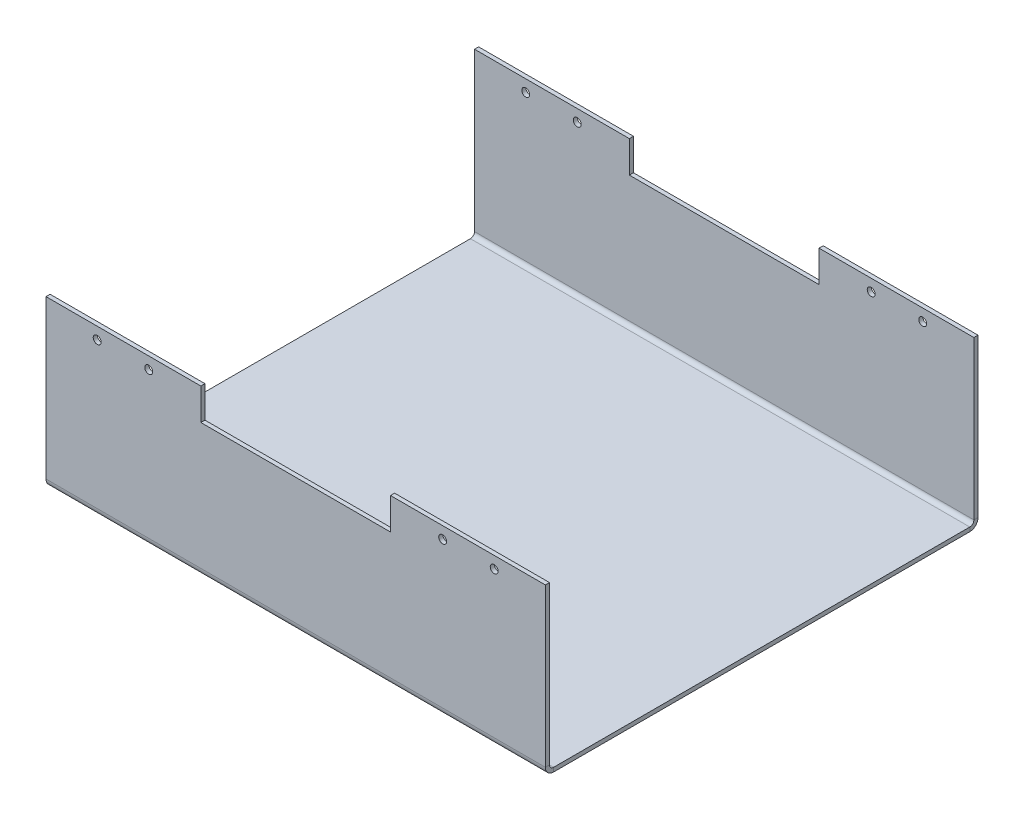
ISO-10303-21;
HEADER;
FILE_DESCRIPTION(('STEP AP214'),'2;1');
FILE_NAME('part.step','',(''),(''),'','','');
FILE_SCHEMA(('AUTOMOTIVE_DESIGN { 1 0 10303 214 1 1 1 1 }'));
ENDSEC;
DATA;
#1=APPLICATION_CONTEXT('core data for automotive mechanical design processes');
#2=APPLICATION_PROTOCOL_DEFINITION('international standard','automotive_design',2000,#1);
#3=PRODUCT_CONTEXT('',#1,'mechanical');
#4=PRODUCT('Part','Part','',(#3));
#5=PRODUCT_RELATED_PRODUCT_CATEGORY('part','',(#4));
#6=PRODUCT_DEFINITION_FORMATION('','',#4);
#7=PRODUCT_DEFINITION_CONTEXT('part definition',#1,'design');
#8=PRODUCT_DEFINITION('design','',#6,#7);
#9=PRODUCT_DEFINITION_SHAPE('','',#8);
#10=(LENGTH_UNIT() NAMED_UNIT(*) SI_UNIT(.MILLI.,.METRE.));
#11=(NAMED_UNIT(*) PLANE_ANGLE_UNIT() SI_UNIT($,.RADIAN.));
#12=(NAMED_UNIT(*) SI_UNIT($,.STERADIAN.) SOLID_ANGLE_UNIT());
#13=UNCERTAINTY_MEASURE_WITH_UNIT(LENGTH_MEASURE(1.E-05),#10,'distance_accuracy_value','');
#14=(GEOMETRIC_REPRESENTATION_CONTEXT(3) GLOBAL_UNCERTAINTY_ASSIGNED_CONTEXT((#13)) GLOBAL_UNIT_ASSIGNED_CONTEXT((#10,
#11,#12)) REPRESENTATION_CONTEXT('',''));
#15=CARTESIAN_POINT('',(0.,0.,0.));
#16=DIRECTION('',(0.,0.,1.));
#17=DIRECTION('',(1.,0.,0.));
#18=AXIS2_PLACEMENT_3D('',#15,#16,#17);
#19=CARTESIAN_POINT('',(200.64222,3.302,301.924236700255));
#20=DIRECTION('',(0.,1.,0.));
#21=DIRECTION('',(0.,0.,1.));
#22=AXIS2_PLACEMENT_3D('',#19,#20,#21);
#23=PLANE('',#22);
#24=DIRECTION('',(0.,0.,-1.));
#25=VECTOR('',#24,1.);
#26=CARTESIAN_POINT('',(200.64222,3.302,301.924236700255));
#27=LINE('',#26,#25);
#28=CARTESIAN_POINT('',(200.64222,3.30200000000001,167.224159596948));
#29=VERTEX_POINT('',#28);
#30=CARTESIAN_POINT('',(200.64222,3.302,-167.224159596948));
#31=VERTEX_POINT('',#30);
#32=EDGE_CURVE('E48',#29,#31,#27,.T.);
#33=ORIENTED_EDGE('',*,*,#32,.T.);
#34=DIRECTION('',(-1.,0.,0.));
#35=VECTOR('',#34,1.);
#36=CARTESIAN_POINT('',(200.64222,3.302,-167.224159596948));
#37=LINE('',#36,#35);
#38=CARTESIAN_POINT('',(-200.64222,3.302,-167.224159596948));
#39=VERTEX_POINT('',#38);
#40=EDGE_CURVE('E331',#31,#39,#37,.T.);
#41=ORIENTED_EDGE('',*,*,#40,.T.);
#42=DIRECTION('',(0.,0.,1.));
#43=VECTOR('',#42,1.);
#44=CARTESIAN_POINT('',(-200.64222,3.302,301.924236700255));
#45=LINE('',#44,#43);
#46=CARTESIAN_POINT('',(-200.64222,3.302,167.224159596948));
#47=VERTEX_POINT('',#46);
#48=EDGE_CURVE('E324',#39,#47,#45,.T.);
#49=ORIENTED_EDGE('',*,*,#48,.T.);
#50=DIRECTION('',(-1.,0.,0.));
#51=VECTOR('',#50,1.);
#52=CARTESIAN_POINT('',(200.64222,3.302,167.224159596948));
#53=LINE('',#52,#51);
#54=EDGE_CURVE('E321',#29,#47,#53,.T.);
#55=ORIENTED_EDGE('',*,*,#54,.F.);
#56=EDGE_LOOP('',(#33,#41,#49,#55));
#57=FACE_BOUND('',#56,.T.);
#58=ADVANCED_FACE('F44',(#57),#23,.T.);
#59=CARTESIAN_POINT('',(200.64222,0.,301.924236700255));
#60=DIRECTION('',(0.,1.,0.));
#61=DIRECTION('',(0.,0.,1.));
#62=AXIS2_PLACEMENT_3D('',#59,#60,#61);
#63=PLANE('',#62);
#64=DIRECTION('',(-1.,0.,0.));
#65=VECTOR('',#64,1.);
#66=CARTESIAN_POINT('',(200.64222,0.,-167.224159596948));
#67=LINE('',#66,#65);
#68=CARTESIAN_POINT('',(200.64222,0.,-167.224159596948));
#69=VERTEX_POINT('',#68);
#70=CARTESIAN_POINT('',(-200.64222,0.,-167.224159596948));
#71=VERTEX_POINT('',#70);
#72=EDGE_CURVE('E53',#69,#71,#67,.T.);
#73=ORIENTED_EDGE('',*,*,#72,.F.);
#74=DIRECTION('',(0.,0.,-1.));
#75=VECTOR('',#74,1.);
#76=CARTESIAN_POINT('',(200.64222,0.,301.924236700255));
#77=LINE('',#76,#75);
#78=CARTESIAN_POINT('',(200.64222,0.,167.224159596948));
#79=VERTEX_POINT('',#78);
#80=EDGE_CURVE('E69',#79,#69,#77,.T.);
#81=ORIENTED_EDGE('',*,*,#80,.F.);
#82=DIRECTION('',(-1.,0.,0.));
#83=VECTOR('',#82,1.);
#84=CARTESIAN_POINT('',(200.64222,0.,167.224159596948));
#85=LINE('',#84,#83);
#86=CARTESIAN_POINT('',(-200.64222,0.,167.224159596948));
#87=VERTEX_POINT('',#86);
#88=EDGE_CURVE('E327',#79,#87,#85,.T.);
#89=ORIENTED_EDGE('',*,*,#88,.T.);
#90=DIRECTION('',(0.,0.,1.));
#91=VECTOR('',#90,1.);
#92=CARTESIAN_POINT('',(-200.64222,0.,301.924236700255));
#93=LINE('',#92,#91);
#94=EDGE_CURVE('E61',#71,#87,#93,.T.);
#95=ORIENTED_EDGE('',*,*,#94,.F.);
#96=EDGE_LOOP('',(#73,#81,#89,#95));
#97=FACE_BOUND('',#96,.T.);
#98=ADVANCED_FACE('F378',(#97),#63,.F.);
#99=CARTESIAN_POINT('',(-200.64222,3.302,301.924236700255));
#100=DIRECTION('',(1.,0.,0.));
#101=DIRECTION('',(0.,0.,-1.));
#102=AXIS2_PLACEMENT_3D('',#99,#100,#101);
#103=PLANE('',#102);
#104=DIRECTION('',(0.,1.,0.));
#105=VECTOR('',#104,1.);
#106=CARTESIAN_POINT('',(-200.64222,3.30199999999997,-167.224159596948));
#107=LINE('',#106,#105);
#108=EDGE_CURVE('E12',#71,#39,#107,.T.);
#109=ORIENTED_EDGE('',*,*,#108,.F.);
#110=ORIENTED_EDGE('',*,*,#94,.T.);
#111=DIRECTION('',(0.,1.,0.));
#112=VECTOR('',#111,1.);
#113=CARTESIAN_POINT('',(-200.64222,3.30199999999999,167.224159596948));
#114=LINE('',#113,#112);
#115=EDGE_CURVE('E323',#87,#47,#114,.T.);
#116=ORIENTED_EDGE('',*,*,#115,.T.);
#117=ORIENTED_EDGE('',*,*,#48,.F.);
#118=EDGE_LOOP('',(#109,#110,#116,#117));
#119=FACE_BOUND('',#118,.T.);
#120=ADVANCED_FACE('F46',(#119),#103,.F.);
#121=CARTESIAN_POINT('',(200.64222,3.302,301.924236700255));
#122=DIRECTION('',(-1.,0.,0.));
#123=DIRECTION('',(0.,0.,1.));
#124=AXIS2_PLACEMENT_3D('',#121,#122,#123);
#125=PLANE('',#124);
#126=DIRECTION('',(0.,-1.,0.));
#127=VECTOR('',#126,1.);
#128=CARTESIAN_POINT('',(200.64222,3.30199999999997,-167.224159596948));
#129=LINE('',#128,#127);
#130=EDGE_CURVE('E334',#31,#69,#129,.T.);
#131=ORIENTED_EDGE('',*,*,#130,.F.);
#132=ORIENTED_EDGE('',*,*,#32,.F.);
#133=DIRECTION('',(0.,-1.,0.));
#134=VECTOR('',#133,1.);
#135=CARTESIAN_POINT('',(200.64222,3.30199999999999,167.224159596948));
#136=LINE('',#135,#134);
#137=EDGE_CURVE('E329',#29,#79,#136,.T.);
#138=ORIENTED_EDGE('',*,*,#137,.T.);
#139=ORIENTED_EDGE('',*,*,#80,.T.);
#140=EDGE_LOOP('',(#131,#132,#138,#139));
#141=FACE_BOUND('',#140,.T.);
#142=ADVANCED_FACE('F345',(#141),#125,.F.);
#143=CARTESIAN_POINT('',(200.64222,6.604,167.224159596948));
#144=DIRECTION('',(-1.,0.,0.));
#145=DIRECTION('',(0.,0.,1.));
#146=AXIS2_PLACEMENT_3D('',#143,#144,#145);
#147=PLANE('',#146);
#148=DIRECTION('',(0.,0.,1.));
#149=VECTOR('',#148,1.);
#150=CARTESIAN_POINT('',(200.64222,6.60400000000003,170.526159596948));
#151=LINE('',#150,#149);
#152=CARTESIAN_POINT('',(200.64222,6.604,170.526159596948));
#153=VERTEX_POINT('',#152);
#154=CARTESIAN_POINT('',(200.64222,6.60400000000005,173.828159596948));
#155=VERTEX_POINT('',#154);
#156=EDGE_CURVE('E244',#153,#155,#151,.T.);
#157=ORIENTED_EDGE('',*,*,#156,.T.);
#158=CARTESIAN_POINT('',(200.64222,6.604,167.224159596948));
#159=DIRECTION('',(1.,0.,0.));
#160=DIRECTION('',(0.,0.,-1.));
#161=AXIS2_PLACEMENT_3D('',#158,#159,#160);
#162=CIRCLE('',#161,6.604);
#163=EDGE_CURVE('E253',#155,#79,#162,.T.);
#164=ORIENTED_EDGE('',*,*,#163,.T.);
#165=ORIENTED_EDGE('',*,*,#137,.F.);
#166=CARTESIAN_POINT('',(200.64222,6.604,167.224159596948));
#167=DIRECTION('',(1.,0.,0.));
#168=DIRECTION('',(0.,0.,-1.));
#169=AXIS2_PLACEMENT_3D('',#166,#167,#168);
#170=CIRCLE('',#169,3.30199999999999);
#171=EDGE_CURVE('E311',#153,#29,#170,.T.);
#172=ORIENTED_EDGE('',*,*,#171,.F.);
#173=EDGE_LOOP('',(#157,#164,#165,#172));
#174=FACE_BOUND('',#173,.T.);
#175=ADVANCED_FACE('F382',(#174),#147,.F.);
#176=CARTESIAN_POINT('',(-200.64222,6.604,167.224159596948));
#177=DIRECTION('',(1.,0.,0.));
#178=DIRECTION('',(0.,0.,-1.));
#179=AXIS2_PLACEMENT_3D('',#176,#177,#178);
#180=PLANE('',#179);
#181=CARTESIAN_POINT('',(-200.64222,6.604,167.224159596948));
#182=DIRECTION('',(1.,0.,0.));
#183=DIRECTION('',(0.,0.,-1.));
#184=AXIS2_PLACEMENT_3D('',#181,#182,#183);
#185=CIRCLE('',#184,6.604);
#186=CARTESIAN_POINT('',(-200.64222,6.60400000000003,173.828159596948));
#187=VERTEX_POINT('',#186);
#188=EDGE_CURVE('E315',#87,#187,#185,.F.);
#189=ORIENTED_EDGE('',*,*,#188,.T.);
#190=DIRECTION('',(0.,0.,-1.));
#191=VECTOR('',#190,1.);
#192=CARTESIAN_POINT('',(-200.64222,6.60400000000003,170.526159596948));
#193=LINE('',#192,#191);
#194=CARTESIAN_POINT('',(-200.64222,6.60400000000003,170.526159596948));
#195=VERTEX_POINT('',#194);
#196=EDGE_CURVE('E303',#187,#195,#193,.T.);
#197=ORIENTED_EDGE('',*,*,#196,.T.);
#198=CARTESIAN_POINT('',(-200.64222,6.604,167.224159596948));
#199=DIRECTION('',(-1.,0.,0.));
#200=DIRECTION('',(0.,0.,1.));
#201=AXIS2_PLACEMENT_3D('',#198,#199,#200);
#202=CIRCLE('',#201,3.302);
#203=EDGE_CURVE('E314',#47,#195,#202,.T.);
#204=ORIENTED_EDGE('',*,*,#203,.F.);
#205=ORIENTED_EDGE('',*,*,#115,.F.);
#206=EDGE_LOOP('',(#189,#197,#204,#205));
#207=FACE_BOUND('',#206,.T.);
#208=ADVANCED_FACE('F397',(#207),#180,.F.);
#209=CARTESIAN_POINT('',(-401.373436826096,6.604,167.224159596948));
#210=DIRECTION('',(1.,0.,0.));
#211=DIRECTION('',(0.,0.,-1.));
#212=AXIS2_PLACEMENT_3D('',#209,#210,#211);
#213=CYLINDRICAL_SURFACE('',#212,3.302);
#214=ORIENTED_EDGE('',*,*,#54,.T.);
#215=ORIENTED_EDGE('',*,*,#203,.T.);
#216=DIRECTION('',(-1.,0.,0.));
#217=VECTOR('',#216,1.);
#218=CARTESIAN_POINT('',(200.64222,6.60400000000003,170.526159596948));
#219=LINE('',#218,#217);
#220=EDGE_CURVE('E272',#153,#195,#219,.T.);
#221=ORIENTED_EDGE('',*,*,#220,.F.);
#222=ORIENTED_EDGE('',*,*,#171,.T.);
#223=EDGE_LOOP('',(#214,#215,#221,#222));
#224=FACE_BOUND('',#223,.T.);
#225=ADVANCED_FACE('F386',(#224),#213,.F.);
#226=CARTESIAN_POINT('',(-401.373436826096,6.604,167.224159596948));
#227=DIRECTION('',(1.,0.,0.));
#228=DIRECTION('',(0.,0.,-1.));
#229=AXIS2_PLACEMENT_3D('',#226,#227,#228);
#230=CYLINDRICAL_SURFACE('',#229,6.604);
#231=ORIENTED_EDGE('',*,*,#88,.F.);
#232=ORIENTED_EDGE('',*,*,#163,.F.);
#233=DIRECTION('',(-1.,0.,0.));
#234=VECTOR('',#233,1.);
#235=CARTESIAN_POINT('',(200.64222,6.60400000000003,173.828159596948));
#236=LINE('',#235,#234);
#237=EDGE_CURVE('E306',#155,#187,#236,.T.);
#238=ORIENTED_EDGE('',*,*,#237,.T.);
#239=ORIENTED_EDGE('',*,*,#188,.F.);
#240=EDGE_LOOP('',(#231,#232,#238,#239));
#241=FACE_BOUND('',#240,.T.);
#242=ADVANCED_FACE('F400',(#241),#230,.T.);
#243=CARTESIAN_POINT('',(76.2000000000012,133.523922896692,170.526159596947));
#244=DIRECTION('',(0.,-1.,0.));
#245=DIRECTION('',(-1.,0.,0.));
#246=AXIS2_PLACEMENT_3D('',#243,#244,#245);
#247=PLANE('',#246);
#248=DIRECTION('',(1.,0.,0.));
#249=VECTOR('',#248,1.);
#250=CARTESIAN_POINT('',(76.2000000000012,133.523922896692,173.828159596947));
#251=LINE('',#250,#249);
#252=CARTESIAN_POINT('',(76.2000000000012,133.523922896692,173.828159596947));
#253=VERTEX_POINT('',#252);
#254=CARTESIAN_POINT('',(200.64222,133.523922896692,173.828159596947));
#255=VERTEX_POINT('',#254);
#256=EDGE_CURVE('E300',#253,#255,#251,.T.);
#257=ORIENTED_EDGE('',*,*,#256,.T.);
#258=DIRECTION('',(0.,0.,1.));
#259=VECTOR('',#258,1.);
#260=CARTESIAN_POINT('',(200.64222,133.523922896692,170.526159596947));
#261=LINE('',#260,#259);
#262=CARTESIAN_POINT('',(200.64222,133.523922896692,170.526159596947));
#263=VERTEX_POINT('',#262);
#264=EDGE_CURVE('E254',#263,#255,#261,.T.);
#265=ORIENTED_EDGE('',*,*,#264,.F.);
#266=DIRECTION('',(1.,0.,0.));
#267=VECTOR('',#266,1.);
#268=CARTESIAN_POINT('',(76.2000000000012,133.523922896692,170.526159596947));
#269=LINE('',#268,#267);
#270=CARTESIAN_POINT('',(76.2000000000012,133.523922896692,170.526159596947));
#271=VERTEX_POINT('',#270);
#272=EDGE_CURVE('E259',#271,#263,#269,.T.);
#273=ORIENTED_EDGE('',*,*,#272,.F.);
#274=DIRECTION('',(0.,0.,1.));
#275=VECTOR('',#274,1.);
#276=CARTESIAN_POINT('',(76.2000000000012,133.523922896692,170.526159596947));
#277=LINE('',#276,#275);
#278=EDGE_CURVE('E297',#271,#253,#277,.T.);
#279=ORIENTED_EDGE('',*,*,#278,.T.);
#280=EDGE_LOOP('',(#257,#265,#273,#279));
#281=FACE_BOUND('',#280,.T.);
#282=ADVANCED_FACE('F411',(#281),#247,.F.);
#283=CARTESIAN_POINT('',(76.2000000000013,108.123922896692,170.526159596947));
#284=DIRECTION('',(1.,0.,0.));
#285=DIRECTION('',(0.,-1.,0.));
#286=AXIS2_PLACEMENT_3D('',#283,#284,#285);
#287=PLANE('',#286);
#288=DIRECTION('',(0.,1.,0.));
#289=VECTOR('',#288,1.);
#290=CARTESIAN_POINT('',(76.2000000000013,108.123922896692,173.828159596947));
#291=LINE('',#290,#289);
#292=CARTESIAN_POINT('',(76.2000000000013,108.123922896692,173.828159596947));
#293=VERTEX_POINT('',#292);
#294=EDGE_CURVE('E295',#293,#253,#291,.T.);
#295=ORIENTED_EDGE('',*,*,#294,.T.);
#296=ORIENTED_EDGE('',*,*,#278,.F.);
#297=DIRECTION('',(0.,1.,0.));
#298=VECTOR('',#297,1.);
#299=CARTESIAN_POINT('',(76.2000000000013,108.123922896692,170.526159596947));
#300=LINE('',#299,#298);
#301=CARTESIAN_POINT('',(76.2000000000013,108.123922896692,170.526159596947));
#302=VERTEX_POINT('',#301);
#303=EDGE_CURVE('E262',#302,#271,#300,.T.);
#304=ORIENTED_EDGE('',*,*,#303,.F.);
#305=DIRECTION('',(0.,0.,1.));
#306=VECTOR('',#305,1.);
#307=CARTESIAN_POINT('',(76.2000000000013,108.123922896692,170.526159596947));
#308=LINE('',#307,#306);
#309=EDGE_CURVE('E292',#302,#293,#308,.T.);
#310=ORIENTED_EDGE('',*,*,#309,.T.);
#311=EDGE_LOOP('',(#295,#296,#304,#310));
#312=FACE_BOUND('',#311,.T.);
#313=ADVANCED_FACE('F417',(#312),#287,.F.);
#314=CARTESIAN_POINT('',(76.2000000000013,108.123922896692,170.526159596947));
#315=DIRECTION('',(0.,-1.,0.));
#316=DIRECTION('',(-1.,0.,0.));
#317=AXIS2_PLACEMENT_3D('',#314,#315,#316);
#318=PLANE('',#317);
#319=DIRECTION('',(1.,0.,0.));
#320=VECTOR('',#319,1.);
#321=CARTESIAN_POINT('',(76.2000000000013,108.123922896692,173.828159596947));
#322=LINE('',#321,#320);
#323=CARTESIAN_POINT('',(-76.1999999999988,108.123922896692,173.828159596947));
#324=VERTEX_POINT('',#323);
#325=EDGE_CURVE('E290',#324,#293,#322,.T.);
#326=ORIENTED_EDGE('',*,*,#325,.T.);
#327=ORIENTED_EDGE('',*,*,#309,.F.);
#328=DIRECTION('',(1.,0.,0.));
#329=VECTOR('',#328,1.);
#330=CARTESIAN_POINT('',(76.2000000000013,108.123922896692,170.526159596947));
#331=LINE('',#330,#329);
#332=CARTESIAN_POINT('',(-76.1999999999988,108.123922896692,170.526159596947));
#333=VERTEX_POINT('',#332);
#334=EDGE_CURVE('E264',#333,#302,#331,.T.);
#335=ORIENTED_EDGE('',*,*,#334,.F.);
#336=DIRECTION('',(0.,0.,1.));
#337=VECTOR('',#336,1.);
#338=CARTESIAN_POINT('',(-76.1999999999988,108.123922896692,170.526159596947));
#339=LINE('',#338,#337);
#340=EDGE_CURVE('E287',#333,#324,#339,.T.);
#341=ORIENTED_EDGE('',*,*,#340,.T.);
#342=EDGE_LOOP('',(#326,#327,#335,#341));
#343=FACE_BOUND('',#342,.T.);
#344=ADVANCED_FACE('F422',(#343),#318,.F.);
#345=CARTESIAN_POINT('',(-76.1999999999988,108.123922896692,170.526159596947));
#346=DIRECTION('',(-1.,0.,0.));
#347=DIRECTION('',(0.,1.,0.));
#348=AXIS2_PLACEMENT_3D('',#345,#346,#347);
#349=PLANE('',#348);
#350=DIRECTION('',(0.,-1.,0.));
#351=VECTOR('',#350,1.);
#352=CARTESIAN_POINT('',(-76.1999999999988,108.123922896692,173.828159596947));
#353=LINE('',#352,#351);
#354=CARTESIAN_POINT('',(-76.1999999999987,133.523922896692,173.828159596947));
#355=VERTEX_POINT('',#354);
#356=EDGE_CURVE('E285',#355,#324,#353,.T.);
#357=ORIENTED_EDGE('',*,*,#356,.T.);
#358=ORIENTED_EDGE('',*,*,#340,.F.);
#359=DIRECTION('',(0.,-1.,0.));
#360=VECTOR('',#359,1.);
#361=CARTESIAN_POINT('',(-76.1999999999988,108.123922896692,170.526159596947));
#362=LINE('',#361,#360);
#363=CARTESIAN_POINT('',(-76.1999999999987,133.523922896692,170.526159596947));
#364=VERTEX_POINT('',#363);
#365=EDGE_CURVE('E266',#364,#333,#362,.T.);
#366=ORIENTED_EDGE('',*,*,#365,.F.);
#367=DIRECTION('',(0.,0.,1.));
#368=VECTOR('',#367,1.);
#369=CARTESIAN_POINT('',(-76.1999999999987,133.523922896692,170.526159596947));
#370=LINE('',#369,#368);
#371=EDGE_CURVE('E282',#364,#355,#370,.T.);
#372=ORIENTED_EDGE('',*,*,#371,.T.);
#373=EDGE_LOOP('',(#357,#358,#366,#372));
#374=FACE_BOUND('',#373,.T.);
#375=ADVANCED_FACE('F426',(#374),#349,.F.);
#376=CARTESIAN_POINT('',(-76.1999999999987,133.523922896692,170.526159596947));
#377=DIRECTION('',(0.,-1.,0.));
#378=DIRECTION('',(-1.,0.,0.));
#379=AXIS2_PLACEMENT_3D('',#376,#377,#378);
#380=PLANE('',#379);
#381=DIRECTION('',(1.,0.,0.));
#382=VECTOR('',#381,1.);
#383=CARTESIAN_POINT('',(-76.1999999999987,133.523922896692,173.828159596947));
#384=LINE('',#383,#382);
#385=CARTESIAN_POINT('',(-200.64222,133.523922896692,173.828159596947));
#386=VERTEX_POINT('',#385);
#387=EDGE_CURVE('E280',#386,#355,#384,.T.);
#388=ORIENTED_EDGE('',*,*,#387,.T.);
#389=ORIENTED_EDGE('',*,*,#371,.F.);
#390=DIRECTION('',(1.,0.,0.));
#391=VECTOR('',#390,1.);
#392=CARTESIAN_POINT('',(-76.1999999999987,133.523922896692,170.526159596947));
#393=LINE('',#392,#391);
#394=CARTESIAN_POINT('',(-200.64222,133.523922896692,170.526159596947));
#395=VERTEX_POINT('',#394);
#396=EDGE_CURVE('E268',#395,#364,#393,.T.);
#397=ORIENTED_EDGE('',*,*,#396,.F.);
#398=DIRECTION('',(0.,0.,1.));
#399=VECTOR('',#398,1.);
#400=CARTESIAN_POINT('',(-200.64222,133.523922896692,170.526159596947));
#401=LINE('',#400,#399);
#402=EDGE_CURVE('E277',#395,#386,#401,.T.);
#403=ORIENTED_EDGE('',*,*,#402,.T.);
#404=EDGE_LOOP('',(#388,#389,#397,#403));
#405=FACE_BOUND('',#404,.T.);
#406=ADVANCED_FACE('F429',(#405),#380,.F.);
#407=CARTESIAN_POINT('',(200.64222,133.523922896692,170.526159596947));
#408=DIRECTION('',(0.,0.,-1.));
#409=DIRECTION('',(0.,1.,0.));
#410=AXIS2_PLACEMENT_3D('',#407,#408,#409);
#411=PLANE('',#410);
#412=CARTESIAN_POINT('',(159.512,123.998922896692,170.526159596947));
#413=DIRECTION('',(0.,0.,-1.));
#414=DIRECTION('',(0.,1.,0.));
#415=AXIS2_PLACEMENT_3D('',#412,#413,#414);
#416=CIRCLE('',#415,3.17499999999997);
#417=CARTESIAN_POINT('',(159.512,127.173922896692,170.526159596947));
#418=VERTEX_POINT('',#417);
#419=EDGE_CURVE('E788',#418,#418,#416,.T.);
#420=ORIENTED_EDGE('',*,*,#419,.F.);
#421=EDGE_LOOP('',(#420));
#422=FACE_BOUND('',#421,.T.);
#423=CARTESIAN_POINT('',(118.11,123.998922896692,170.526159596947));
#424=DIRECTION('',(0.,0.,-1.));
#425=DIRECTION('',(0.,1.,0.));
#426=AXIS2_PLACEMENT_3D('',#423,#424,#425);
#427=CIRCLE('',#426,3.175);
#428=CARTESIAN_POINT('',(118.11,127.173922896692,170.526159596947));
#429=VERTEX_POINT('',#428);
#430=EDGE_CURVE('E810',#429,#429,#427,.T.);
#431=ORIENTED_EDGE('',*,*,#430,.F.);
#432=EDGE_LOOP('',(#431));
#433=FACE_BOUND('',#432,.T.);
#434=CARTESIAN_POINT('',(-118.11,123.998922896692,170.526159596947));
#435=DIRECTION('',(0.,0.,-1.));
#436=DIRECTION('',(0.,1.,0.));
#437=AXIS2_PLACEMENT_3D('',#434,#435,#436);
#438=CIRCLE('',#437,3.175);
#439=CARTESIAN_POINT('',(-118.11,127.173922896692,170.526159596947));
#440=VERTEX_POINT('',#439);
#441=EDGE_CURVE('E822',#440,#440,#438,.T.);
#442=ORIENTED_EDGE('',*,*,#441,.F.);
#443=EDGE_LOOP('',(#442));
#444=FACE_BOUND('',#443,.T.);
#445=CARTESIAN_POINT('',(-159.512,123.998922896692,170.526159596947));
#446=DIRECTION('',(0.,0.,-1.));
#447=DIRECTION('',(0.,1.,0.));
#448=AXIS2_PLACEMENT_3D('',#445,#446,#447);
#449=CIRCLE('',#448,3.17499999999997);
#450=CARTESIAN_POINT('',(-159.512,127.173922896692,170.526159596947));
#451=VERTEX_POINT('',#450);
#452=EDGE_CURVE('E236',#451,#451,#449,.T.);
#453=ORIENTED_EDGE('',*,*,#452,.F.);
#454=EDGE_LOOP('',(#453));
#455=FACE_BOUND('',#454,.T.);
#456=DIRECTION('',(0.,-1.,0.));
#457=VECTOR('',#456,1.);
#458=CARTESIAN_POINT('',(200.64222,133.523922896692,170.526159596947));
#459=LINE('',#458,#457);
#460=EDGE_CURVE('E274',#263,#153,#459,.T.);
#461=ORIENTED_EDGE('',*,*,#460,.T.);
#462=ORIENTED_EDGE('',*,*,#220,.T.);
#463=DIRECTION('',(0.,1.,0.));
#464=VECTOR('',#463,1.);
#465=CARTESIAN_POINT('',(-200.64222,133.523922896692,170.526159596947));
#466=LINE('',#465,#464);
#467=EDGE_CURVE('E270',#195,#395,#466,.T.);
#468=ORIENTED_EDGE('',*,*,#467,.T.);
#469=ORIENTED_EDGE('',*,*,#396,.T.);
#470=ORIENTED_EDGE('',*,*,#365,.T.);
#471=ORIENTED_EDGE('',*,*,#334,.T.);
#472=ORIENTED_EDGE('',*,*,#303,.T.);
#473=ORIENTED_EDGE('',*,*,#272,.T.);
#474=EDGE_LOOP('',(#461,#462,#468,#469,#470,#471,#472,#473));
#475=FACE_BOUND('',#474,.T.);
#476=ADVANCED_FACE('F390',(#422,#433,#444,#455,#475),#411,.T.);
#477=CARTESIAN_POINT('',(-200.64222,133.523922896692,170.526159596947));
#478=DIRECTION('',(1.,0.,0.));
#479=DIRECTION('',(0.,-1.,0.));
#480=AXIS2_PLACEMENT_3D('',#477,#478,#479);
#481=PLANE('',#480);
#482=ORIENTED_EDGE('',*,*,#196,.F.);
#483=DIRECTION('',(0.,1.,0.));
#484=VECTOR('',#483,1.);
#485=CARTESIAN_POINT('',(-200.64222,133.523922896692,173.828159596947));
#486=LINE('',#485,#484);
#487=EDGE_CURVE('E257',#187,#386,#486,.T.);
#488=ORIENTED_EDGE('',*,*,#487,.T.);
#489=ORIENTED_EDGE('',*,*,#402,.F.);
#490=ORIENTED_EDGE('',*,*,#467,.F.);
#491=EDGE_LOOP('',(#482,#488,#489,#490));
#492=FACE_BOUND('',#491,.T.);
#493=ADVANCED_FACE('F394',(#492),#481,.F.);
#494=CARTESIAN_POINT('',(200.64222,133.523922896692,173.828159596947));
#495=DIRECTION('',(0.,0.,-1.));
#496=DIRECTION('',(0.,1.,0.));
#497=AXIS2_PLACEMENT_3D('',#494,#495,#496);
#498=PLANE('',#497);
#499=CARTESIAN_POINT('',(159.512,123.998922896692,173.828159596948));
#500=DIRECTION('',(0.,0.,1.));
#501=DIRECTION('',(-1.,0.,0.));
#502=AXIS2_PLACEMENT_3D('',#499,#500,#501);
#503=CIRCLE('',#502,3.17499999999997);
#504=CARTESIAN_POINT('',(156.337,123.998922896692,173.828159596948));
#505=VERTEX_POINT('',#504);
#506=EDGE_CURVE('E791',#505,#505,#503,.T.);
#507=ORIENTED_EDGE('',*,*,#506,.F.);
#508=EDGE_LOOP('',(#507));
#509=FACE_BOUND('',#508,.T.);
#510=CARTESIAN_POINT('',(118.11,123.998922896692,173.828159596948));
#511=DIRECTION('',(0.,0.,1.));
#512=DIRECTION('',(-1.,0.,0.));
#513=AXIS2_PLACEMENT_3D('',#510,#511,#512);
#514=CIRCLE('',#513,3.175);
#515=CARTESIAN_POINT('',(114.935,123.998922896692,173.828159596948));
#516=VERTEX_POINT('',#515);
#517=EDGE_CURVE('E801',#516,#516,#514,.T.);
#518=ORIENTED_EDGE('',*,*,#517,.F.);
#519=EDGE_LOOP('',(#518));
#520=FACE_BOUND('',#519,.T.);
#521=CARTESIAN_POINT('',(-118.11,123.998922896692,173.828159596948));
#522=DIRECTION('',(0.,0.,1.));
#523=DIRECTION('',(1.,0.,0.));
#524=AXIS2_PLACEMENT_3D('',#521,#522,#523);
#525=CIRCLE('',#524,3.175);
#526=CARTESIAN_POINT('',(-114.935,123.998922896692,173.828159596948));
#527=VERTEX_POINT('',#526);
#528=EDGE_CURVE('E813',#527,#527,#525,.T.);
#529=ORIENTED_EDGE('',*,*,#528,.F.);
#530=EDGE_LOOP('',(#529));
#531=FACE_BOUND('',#530,.T.);
#532=CARTESIAN_POINT('',(-159.512,123.998922896692,173.828159596948));
#533=DIRECTION('',(0.,0.,1.));
#534=DIRECTION('',(1.,0.,0.));
#535=AXIS2_PLACEMENT_3D('',#532,#533,#534);
#536=CIRCLE('',#535,3.17499999999997);
#537=CARTESIAN_POINT('',(-156.337,123.998922896692,173.828159596948));
#538=VERTEX_POINT('',#537);
#539=EDGE_CURVE('E825',#538,#538,#536,.T.);
#540=ORIENTED_EDGE('',*,*,#539,.F.);
#541=EDGE_LOOP('',(#540));
#542=FACE_BOUND('',#541,.T.);
#543=ORIENTED_EDGE('',*,*,#237,.F.);
#544=DIRECTION('',(0.,-1.,0.));
#545=VECTOR('',#544,1.);
#546=CARTESIAN_POINT('',(200.64222,133.523922896692,173.828159596947));
#547=LINE('',#546,#545);
#548=EDGE_CURVE('E251',#255,#155,#547,.T.);
#549=ORIENTED_EDGE('',*,*,#548,.F.);
#550=ORIENTED_EDGE('',*,*,#256,.F.);
#551=ORIENTED_EDGE('',*,*,#294,.F.);
#552=ORIENTED_EDGE('',*,*,#325,.F.);
#553=ORIENTED_EDGE('',*,*,#356,.F.);
#554=ORIENTED_EDGE('',*,*,#387,.F.);
#555=ORIENTED_EDGE('',*,*,#487,.F.);
#556=EDGE_LOOP('',(#543,#549,#550,#551,#552,#553,#554,#555));
#557=FACE_BOUND('',#556,.T.);
#558=ADVANCED_FACE('F403',(#509,#520,#531,#542,#557),#498,.F.);
#559=CARTESIAN_POINT('',(200.64222,133.523922896692,170.526159596947));
#560=DIRECTION('',(-1.,0.,0.));
#561=DIRECTION('',(0.,1.,0.));
#562=AXIS2_PLACEMENT_3D('',#559,#560,#561);
#563=PLANE('',#562);
#564=ORIENTED_EDGE('',*,*,#156,.F.);
#565=ORIENTED_EDGE('',*,*,#460,.F.);
#566=ORIENTED_EDGE('',*,*,#264,.T.);
#567=ORIENTED_EDGE('',*,*,#548,.T.);
#568=EDGE_LOOP('',(#564,#565,#566,#567));
#569=FACE_BOUND('',#568,.T.);
#570=ADVANCED_FACE('F407',(#569),#563,.F.);
#571=CARTESIAN_POINT('',(200.64222,6.604,-167.224159596948));
#572=DIRECTION('',(-1.,0.,0.));
#573=DIRECTION('',(0.,0.,1.));
#574=AXIS2_PLACEMENT_3D('',#571,#572,#573);
#575=PLANE('',#574);
#576=ORIENTED_EDGE('',*,*,#130,.T.);
#577=CARTESIAN_POINT('',(200.64222,6.604,-167.224159596948));
#578=DIRECTION('',(-1.,0.,0.));
#579=DIRECTION('',(0.,0.,1.));
#580=AXIS2_PLACEMENT_3D('',#577,#578,#579);
#581=CIRCLE('',#580,6.604);
#582=CARTESIAN_POINT('',(200.64222,6.60399999999997,-173.828159596948));
#583=VERTEX_POINT('',#582);
#584=EDGE_CURVE('E245',#69,#583,#581,.F.);
#585=ORIENTED_EDGE('',*,*,#584,.T.);
#586=DIRECTION('',(0.,0.,-1.));
#587=VECTOR('',#586,1.);
#588=CARTESIAN_POINT('',(200.64222,6.60399999999997,-170.526159596948));
#589=LINE('',#588,#587);
#590=CARTESIAN_POINT('',(200.64222,6.60399999999992,-170.526159596948));
#591=VERTEX_POINT('',#590);
#592=EDGE_CURVE('E193',#591,#583,#589,.T.);
#593=ORIENTED_EDGE('',*,*,#592,.F.);
#594=CARTESIAN_POINT('',(200.64222,6.604,-167.224159596948));
#595=DIRECTION('',(1.,0.,0.));
#596=DIRECTION('',(0.,0.,-1.));
#597=AXIS2_PLACEMENT_3D('',#594,#595,#596);
#598=CIRCLE('',#597,3.30199999999999);
#599=EDGE_CURVE('E237',#31,#591,#598,.T.);
#600=ORIENTED_EDGE('',*,*,#599,.F.);
#601=EDGE_LOOP('',(#576,#585,#593,#600));
#602=FACE_BOUND('',#601,.T.);
#603=ADVANCED_FACE('F352',(#602),#575,.F.);
#604=CARTESIAN_POINT('',(-200.64222,6.604,-167.224159596948));
#605=DIRECTION('',(1.,0.,0.));
#606=DIRECTION('',(0.,0.,-1.));
#607=AXIS2_PLACEMENT_3D('',#604,#605,#606);
#608=PLANE('',#607);
#609=CARTESIAN_POINT('',(-200.64222,6.604,-167.224159596948));
#610=DIRECTION('',(-1.,0.,0.));
#611=DIRECTION('',(0.,0.,1.));
#612=AXIS2_PLACEMENT_3D('',#609,#610,#611);
#613=CIRCLE('',#612,6.604);
#614=CARTESIAN_POINT('',(-200.64222,6.60399999999997,-173.828159596948));
#615=VERTEX_POINT('',#614);
#616=EDGE_CURVE('E241',#615,#71,#613,.T.);
#617=ORIENTED_EDGE('',*,*,#616,.T.);
#618=ORIENTED_EDGE('',*,*,#108,.T.);
#619=CARTESIAN_POINT('',(-200.64222,6.604,-167.224159596948));
#620=DIRECTION('',(-1.,0.,0.));
#621=DIRECTION('',(0.,0.,1.));
#622=AXIS2_PLACEMENT_3D('',#619,#620,#621);
#623=CIRCLE('',#622,3.302);
#624=CARTESIAN_POINT('',(-200.64222,6.60400000000006,-170.526159596948));
#625=VERTEX_POINT('',#624);
#626=EDGE_CURVE('E240',#625,#39,#623,.T.);
#627=ORIENTED_EDGE('',*,*,#626,.F.);
#628=DIRECTION('',(0.,0.,1.));
#629=VECTOR('',#628,1.);
#630=CARTESIAN_POINT('',(-200.64222,6.60399999999997,-170.526159596948));
#631=LINE('',#630,#629);
#632=EDGE_CURVE('E373',#615,#625,#631,.T.);
#633=ORIENTED_EDGE('',*,*,#632,.F.);
#634=EDGE_LOOP('',(#617,#618,#627,#633));
#635=FACE_BOUND('',#634,.T.);
#636=ADVANCED_FACE('F372',(#635),#608,.F.);
#637=CARTESIAN_POINT('',(401.373436826097,6.604,-167.224159596948));
#638=DIRECTION('',(-1.,0.,0.));
#639=DIRECTION('',(0.,0.,1.));
#640=AXIS2_PLACEMENT_3D('',#637,#638,#639);
#641=CYLINDRICAL_SURFACE('',#640,3.302);
#642=DIRECTION('',(-1.,0.,0.));
#643=VECTOR('',#642,1.);
#644=CARTESIAN_POINT('',(200.64222,6.60399999999997,-170.526159596948));
#645=LINE('',#644,#643);
#646=EDGE_CURVE('E233',#591,#625,#645,.T.);
#647=ORIENTED_EDGE('',*,*,#646,.T.);
#648=ORIENTED_EDGE('',*,*,#626,.T.);
#649=ORIENTED_EDGE('',*,*,#40,.F.);
#650=ORIENTED_EDGE('',*,*,#599,.T.);
#651=EDGE_LOOP('',(#647,#648,#649,#650));
#652=FACE_BOUND('',#651,.T.);
#653=ADVANCED_FACE('F350',(#652),#641,.F.);
#654=CARTESIAN_POINT('',(401.373436826097,6.604,-167.224159596948));
#655=DIRECTION('',(-1.,0.,0.));
#656=DIRECTION('',(0.,0.,1.));
#657=AXIS2_PLACEMENT_3D('',#654,#655,#656);
#658=CYLINDRICAL_SURFACE('',#657,6.604);
#659=DIRECTION('',(-1.,0.,0.));
#660=VECTOR('',#659,1.);
#661=CARTESIAN_POINT('',(200.64222,6.60399999999997,-173.828159596948));
#662=LINE('',#661,#660);
#663=EDGE_CURVE('E198',#583,#615,#662,.T.);
#664=ORIENTED_EDGE('',*,*,#663,.F.);
#665=ORIENTED_EDGE('',*,*,#584,.F.);
#666=ORIENTED_EDGE('',*,*,#72,.T.);
#667=ORIENTED_EDGE('',*,*,#616,.F.);
#668=EDGE_LOOP('',(#664,#665,#666,#667));
#669=FACE_BOUND('',#668,.T.);
#670=ADVANCED_FACE('F377',(#669),#658,.T.);
#671=CARTESIAN_POINT('',(-76.1999999999986,133.523922896693,-170.526159596947));
#672=DIRECTION('',(0.,-1.,0.));
#673=DIRECTION('',(1.,0.,0.));
#674=AXIS2_PLACEMENT_3D('',#671,#672,#673);
#675=PLANE('',#674);
#676=DIRECTION('',(-1.,0.,0.));
#677=VECTOR('',#676,1.);
#678=CARTESIAN_POINT('',(-76.1999999999986,133.523922896693,-173.828159596947));
#679=LINE('',#678,#677);
#680=CARTESIAN_POINT('',(-76.1999999999986,133.523922896693,-173.828159596947));
#681=VERTEX_POINT('',#680);
#682=CARTESIAN_POINT('',(-200.64222,133.523922896692,-173.828159596947));
#683=VERTEX_POINT('',#682);
#684=EDGE_CURVE('E231',#681,#683,#679,.T.);
#685=ORIENTED_EDGE('',*,*,#684,.T.);
#686=DIRECTION('',(0.,0.,-1.));
#687=VECTOR('',#686,1.);
#688=CARTESIAN_POINT('',(-200.64222,133.523922896692,-170.526159596947));
#689=LINE('',#688,#687);
#690=CARTESIAN_POINT('',(-200.64222,133.523922896692,-170.526159596947));
#691=VERTEX_POINT('',#690);
#692=EDGE_CURVE('E248',#691,#683,#689,.T.);
#693=ORIENTED_EDGE('',*,*,#692,.F.);
#694=DIRECTION('',(-1.,0.,0.));
#695=VECTOR('',#694,1.);
#696=CARTESIAN_POINT('',(-76.1999999999986,133.523922896693,-170.526159596947));
#697=LINE('',#696,#695);
#698=CARTESIAN_POINT('',(-76.1999999999986,133.523922896693,-170.526159596947));
#699=VERTEX_POINT('',#698);
#700=EDGE_CURVE('E356',#699,#691,#697,.T.);
#701=ORIENTED_EDGE('',*,*,#700,.F.);
#702=DIRECTION('',(0.,0.,-1.));
#703=VECTOR('',#702,1.);
#704=CARTESIAN_POINT('',(-76.1999999999986,133.523922896693,-170.526159596947));
#705=LINE('',#704,#703);
#706=EDGE_CURVE('E228',#699,#681,#705,.T.);
#707=ORIENTED_EDGE('',*,*,#706,.T.);
#708=EDGE_LOOP('',(#685,#693,#701,#707));
#709=FACE_BOUND('',#708,.T.);
#710=ADVANCED_FACE('F541',(#709),#675,.F.);
#711=CARTESIAN_POINT('',(-76.1999999999987,108.123922896693,-170.526159596947));
#712=DIRECTION('',(-1.,0.,0.));
#713=DIRECTION('',(0.,-1.,0.));
#714=AXIS2_PLACEMENT_3D('',#711,#712,#713);
#715=PLANE('',#714);
#716=DIRECTION('',(0.,1.,0.));
#717=VECTOR('',#716,1.);
#718=CARTESIAN_POINT('',(-76.1999999999987,108.123922896693,-173.828159596947));
#719=LINE('',#718,#717);
#720=CARTESIAN_POINT('',(-76.1999999999987,108.123922896693,-173.828159596947));
#721=VERTEX_POINT('',#720);
#722=EDGE_CURVE('E226',#721,#681,#719,.T.);
#723=ORIENTED_EDGE('',*,*,#722,.T.);
#724=ORIENTED_EDGE('',*,*,#706,.F.);
#725=DIRECTION('',(0.,1.,0.));
#726=VECTOR('',#725,1.);
#727=CARTESIAN_POINT('',(-76.1999999999987,108.123922896693,-170.526159596947));
#728=LINE('',#727,#726);
#729=CARTESIAN_POINT('',(-76.1999999999987,108.123922896693,-170.526159596947));
#730=VERTEX_POINT('',#729);
#731=EDGE_CURVE('E361',#730,#699,#728,.T.);
#732=ORIENTED_EDGE('',*,*,#731,.F.);
#733=DIRECTION('',(0.,0.,-1.));
#734=VECTOR('',#733,1.);
#735=CARTESIAN_POINT('',(-76.1999999999987,108.123922896693,-170.526159596947));
#736=LINE('',#735,#734);
#737=EDGE_CURVE('E223',#730,#721,#736,.T.);
#738=ORIENTED_EDGE('',*,*,#737,.T.);
#739=EDGE_LOOP('',(#723,#724,#732,#738));
#740=FACE_BOUND('',#739,.T.);
#741=ADVANCED_FACE('F548',(#740),#715,.F.);
#742=CARTESIAN_POINT('',(76.2000000000013,108.123922896693,-170.526159596947));
#743=DIRECTION('',(0.,-1.,0.));
#744=DIRECTION('',(1.,0.,0.));
#745=AXIS2_PLACEMENT_3D('',#742,#743,#744);
#746=PLANE('',#745);
#747=DIRECTION('',(-1.,0.,0.));
#748=VECTOR('',#747,1.);
#749=CARTESIAN_POINT('',(76.2000000000013,108.123922896693,-173.828159596947));
#750=LINE('',#749,#748);
#751=CARTESIAN_POINT('',(76.2000000000013,108.123922896693,-173.828159596947));
#752=VERTEX_POINT('',#751);
#753=EDGE_CURVE('E221',#752,#721,#750,.T.);
#754=ORIENTED_EDGE('',*,*,#753,.T.);
#755=ORIENTED_EDGE('',*,*,#737,.F.);
#756=DIRECTION('',(-1.,0.,0.));
#757=VECTOR('',#756,1.);
#758=CARTESIAN_POINT('',(76.2000000000013,108.123922896693,-170.526159596947));
#759=LINE('',#758,#757);
#760=CARTESIAN_POINT('',(76.2000000000013,108.123922896693,-170.526159596947));
#761=VERTEX_POINT('',#760);
#762=EDGE_CURVE('E363',#761,#730,#759,.T.);
#763=ORIENTED_EDGE('',*,*,#762,.F.);
#764=DIRECTION('',(0.,0.,-1.));
#765=VECTOR('',#764,1.);
#766=CARTESIAN_POINT('',(76.2000000000013,108.123922896693,-170.526159596947));
#767=LINE('',#766,#765);
#768=EDGE_CURVE('E218',#761,#752,#767,.T.);
#769=ORIENTED_EDGE('',*,*,#768,.T.);
#770=EDGE_LOOP('',(#754,#755,#763,#769));
#771=FACE_BOUND('',#770,.T.);
#772=ADVANCED_FACE('F561',(#771),#746,.F.);
#773=CARTESIAN_POINT('',(76.2000000000013,108.123922896693,-170.526159596947));
#774=DIRECTION('',(1.,0.,0.));
#775=DIRECTION('',(0.,1.,0.));
#776=AXIS2_PLACEMENT_3D('',#773,#774,#775);
#777=PLANE('',#776);
#778=DIRECTION('',(0.,-1.,0.));
#779=VECTOR('',#778,1.);
#780=CARTESIAN_POINT('',(76.2000000000013,108.123922896693,-173.828159596947));
#781=LINE('',#780,#779);
#782=CARTESIAN_POINT('',(76.2000000000013,133.523922896693,-173.828159596947));
#783=VERTEX_POINT('',#782);
#784=EDGE_CURVE('E211',#783,#752,#781,.T.);
#785=ORIENTED_EDGE('',*,*,#784,.T.);
#786=ORIENTED_EDGE('',*,*,#768,.F.);
#787=DIRECTION('',(0.,-1.,0.));
#788=VECTOR('',#787,1.);
#789=CARTESIAN_POINT('',(76.2000000000013,108.123922896693,-170.526159596947));
#790=LINE('',#789,#788);
#791=CARTESIAN_POINT('',(76.2000000000013,133.523922896693,-170.526159596947));
#792=VERTEX_POINT('',#791);
#793=EDGE_CURVE('E365',#792,#761,#790,.T.);
#794=ORIENTED_EDGE('',*,*,#793,.F.);
#795=DIRECTION('',(0.,0.,-1.));
#796=VECTOR('',#795,1.);
#797=CARTESIAN_POINT('',(76.2000000000013,133.523922896693,-170.526159596947));
#798=LINE('',#797,#796);
#799=EDGE_CURVE('E212',#792,#783,#798,.T.);
#800=ORIENTED_EDGE('',*,*,#799,.T.);
#801=EDGE_LOOP('',(#785,#786,#794,#800));
#802=FACE_BOUND('',#801,.T.);
#803=ADVANCED_FACE('F572',(#802),#777,.F.);
#804=CARTESIAN_POINT('',(76.2000000000013,133.523922896693,-170.526159596947));
#805=DIRECTION('',(0.,-1.,0.));
#806=DIRECTION('',(1.,0.,0.));
#807=AXIS2_PLACEMENT_3D('',#804,#805,#806);
#808=PLANE('',#807);
#809=DIRECTION('',(-1.,0.,0.));
#810=VECTOR('',#809,1.);
#811=CARTESIAN_POINT('',(76.2000000000013,133.523922896693,-173.828159596947));
#812=LINE('',#811,#810);
#813=CARTESIAN_POINT('',(200.64222,133.523922896692,-173.828159596947));
#814=VERTEX_POINT('',#813);
#815=EDGE_CURVE('E203',#814,#783,#812,.T.);
#816=ORIENTED_EDGE('',*,*,#815,.T.);
#817=ORIENTED_EDGE('',*,*,#799,.F.);
#818=DIRECTION('',(-1.,0.,0.));
#819=VECTOR('',#818,1.);
#820=CARTESIAN_POINT('',(76.2000000000013,133.523922896693,-170.526159596947));
#821=LINE('',#820,#819);
#822=CARTESIAN_POINT('',(200.64222,133.523922896692,-170.526159596947));
#823=VERTEX_POINT('',#822);
#824=EDGE_CURVE('E205',#823,#792,#821,.T.);
#825=ORIENTED_EDGE('',*,*,#824,.F.);
#826=DIRECTION('',(0.,0.,-1.));
#827=VECTOR('',#826,1.);
#828=CARTESIAN_POINT('',(200.64222,133.523922896692,-170.526159596947));
#829=LINE('',#828,#827);
#830=EDGE_CURVE('E190',#823,#814,#829,.T.);
#831=ORIENTED_EDGE('',*,*,#830,.T.);
#832=EDGE_LOOP('',(#816,#817,#825,#831));
#833=FACE_BOUND('',#832,.T.);
#834=ADVANCED_FACE('F201',(#833),#808,.F.);
#835=CARTESIAN_POINT('',(200.64222,-470.324550503818,-170.526159596949));
#836=DIRECTION('',(0.,0.,1.));
#837=DIRECTION('',(0.,-1.,0.));
#838=AXIS2_PLACEMENT_3D('',#835,#836,#837);
#839=PLANE('',#838);
#840=CARTESIAN_POINT('',(159.512,123.998922896692,-170.526159596947));
#841=DIRECTION('',(0.,0.,1.));
#842=DIRECTION('',(0.,-1.,0.));
#843=AXIS2_PLACEMENT_3D('',#840,#841,#842);
#844=CIRCLE('',#843,3.17499999999997);
#845=CARTESIAN_POINT('',(159.512,120.823922896692,-170.526159596947));
#846=VERTEX_POINT('',#845);
#847=EDGE_CURVE('E795',#846,#846,#844,.T.);
#848=ORIENTED_EDGE('',*,*,#847,.F.);
#849=EDGE_LOOP('',(#848));
#850=FACE_BOUND('',#849,.T.);
#851=CARTESIAN_POINT('',(118.11,123.998922896692,-170.526159596947));
#852=DIRECTION('',(0.,0.,1.));
#853=DIRECTION('',(0.,-1.,0.));
#854=AXIS2_PLACEMENT_3D('',#851,#852,#853);
#855=CIRCLE('',#854,3.175);
#856=CARTESIAN_POINT('',(118.11,120.823922896692,-170.526159596947));
#857=VERTEX_POINT('',#856);
#858=EDGE_CURVE('E805',#857,#857,#855,.T.);
#859=ORIENTED_EDGE('',*,*,#858,.F.);
#860=EDGE_LOOP('',(#859));
#861=FACE_BOUND('',#860,.T.);
#862=CARTESIAN_POINT('',(-118.11,123.998922896692,-170.526159596947));
#863=DIRECTION('',(0.,0.,1.));
#864=DIRECTION('',(0.,-1.,0.));
#865=AXIS2_PLACEMENT_3D('',#862,#863,#864);
#866=CIRCLE('',#865,3.175);
#867=CARTESIAN_POINT('',(-118.11,120.823922896692,-170.526159596947));
#868=VERTEX_POINT('',#867);
#869=EDGE_CURVE('E817',#868,#868,#866,.T.);
#870=ORIENTED_EDGE('',*,*,#869,.F.);
#871=EDGE_LOOP('',(#870));
#872=FACE_BOUND('',#871,.T.);
#873=CARTESIAN_POINT('',(-159.512,123.998922896692,-170.526159596947));
#874=DIRECTION('',(0.,0.,1.));
#875=DIRECTION('',(0.,-1.,0.));
#876=AXIS2_PLACEMENT_3D('',#873,#874,#875);
#877=CIRCLE('',#876,3.17499999999997);
#878=CARTESIAN_POINT('',(-159.512,120.823922896692,-170.526159596947));
#879=VERTEX_POINT('',#878);
#880=EDGE_CURVE('E829',#879,#879,#877,.T.);
#881=ORIENTED_EDGE('',*,*,#880,.F.);
#882=EDGE_LOOP('',(#881));
#883=FACE_BOUND('',#882,.T.);
#884=ORIENTED_EDGE('',*,*,#646,.F.);
#885=DIRECTION('',(0.,1.,0.));
#886=VECTOR('',#885,1.);
#887=CARTESIAN_POINT('',(200.64222,-470.324550503818,-170.526159596949));
#888=LINE('',#887,#886);
#889=EDGE_CURVE('E206',#591,#823,#888,.T.);
#890=ORIENTED_EDGE('',*,*,#889,.T.);
#891=ORIENTED_EDGE('',*,*,#824,.T.);
#892=ORIENTED_EDGE('',*,*,#793,.T.);
#893=ORIENTED_EDGE('',*,*,#762,.T.);
#894=ORIENTED_EDGE('',*,*,#731,.T.);
#895=ORIENTED_EDGE('',*,*,#700,.T.);
#896=DIRECTION('',(0.,-1.,0.));
#897=VECTOR('',#896,1.);
#898=CARTESIAN_POINT('',(-200.64222,-470.324550503818,-170.526159596949));
#899=LINE('',#898,#897);
#900=EDGE_CURVE('E353',#691,#625,#899,.T.);
#901=ORIENTED_EDGE('',*,*,#900,.T.);
#902=EDGE_LOOP('',(#884,#890,#891,#892,#893,#894,#895,#901));
#903=FACE_BOUND('',#902,.T.);
#904=ADVANCED_FACE('F368',(#850,#861,#872,#883,#903),#839,.T.);
#905=CARTESIAN_POINT('',(200.64222,-470.324550503818,-170.526159596949));
#906=DIRECTION('',(-1.,0.,0.));
#907=DIRECTION('',(0.,-1.,0.));
#908=AXIS2_PLACEMENT_3D('',#905,#906,#907);
#909=PLANE('',#908);
#910=ORIENTED_EDGE('',*,*,#889,.F.);
#911=ORIENTED_EDGE('',*,*,#592,.T.);
#912=DIRECTION('',(0.,1.,0.));
#913=VECTOR('',#912,1.);
#914=CARTESIAN_POINT('',(200.64222,-470.324550503818,-173.828159596949));
#915=LINE('',#914,#913);
#916=EDGE_CURVE('E186',#583,#814,#915,.T.);
#917=ORIENTED_EDGE('',*,*,#916,.T.);
#918=ORIENTED_EDGE('',*,*,#830,.F.);
#919=EDGE_LOOP('',(#910,#911,#917,#918));
#920=FACE_BOUND('',#919,.T.);
#921=ADVANCED_FACE('F189',(#920),#909,.F.);
#922=CARTESIAN_POINT('',(200.64222,-470.324550503818,-173.828159596949));
#923=DIRECTION('',(0.,0.,1.));
#924=DIRECTION('',(0.,-1.,0.));
#925=AXIS2_PLACEMENT_3D('',#922,#923,#924);
#926=PLANE('',#925);
#927=CARTESIAN_POINT('',(159.512,123.998922896692,-173.828159596948));
#928=DIRECTION('',(0.,0.,1.));
#929=DIRECTION('',(-1.,0.,0.));
#930=AXIS2_PLACEMENT_3D('',#927,#928,#929);
#931=CIRCLE('',#930,3.17499999999997);
#932=CARTESIAN_POINT('',(156.337,123.998922896692,-173.828159596948));
#933=VERTEX_POINT('',#932);
#934=EDGE_CURVE('E792',#933,#933,#931,.T.);
#935=ORIENTED_EDGE('',*,*,#934,.T.);
#936=EDGE_LOOP('',(#935));
#937=FACE_BOUND('',#936,.T.);
#938=CARTESIAN_POINT('',(118.11,123.998922896692,-173.828159596948));
#939=DIRECTION('',(0.,0.,1.));
#940=DIRECTION('',(-1.,0.,0.));
#941=AXIS2_PLACEMENT_3D('',#938,#939,#940);
#942=CIRCLE('',#941,3.175);
#943=CARTESIAN_POINT('',(114.935,123.998922896692,-173.828159596948));
#944=VERTEX_POINT('',#943);
#945=EDGE_CURVE('E802',#944,#944,#942,.T.);
#946=ORIENTED_EDGE('',*,*,#945,.T.);
#947=EDGE_LOOP('',(#946));
#948=FACE_BOUND('',#947,.T.);
#949=CARTESIAN_POINT('',(-118.11,123.998922896692,-173.828159596948));
#950=DIRECTION('',(0.,0.,1.));
#951=DIRECTION('',(1.,0.,0.));
#952=AXIS2_PLACEMENT_3D('',#949,#950,#951);
#953=CIRCLE('',#952,3.175);
#954=CARTESIAN_POINT('',(-114.935,123.998922896692,-173.828159596948));
#955=VERTEX_POINT('',#954);
#956=EDGE_CURVE('E814',#955,#955,#953,.T.);
#957=ORIENTED_EDGE('',*,*,#956,.T.);
#958=EDGE_LOOP('',(#957));
#959=FACE_BOUND('',#958,.T.);
#960=CARTESIAN_POINT('',(-159.512,123.998922896692,-173.828159596948));
#961=DIRECTION('',(0.,0.,1.));
#962=DIRECTION('',(1.,0.,0.));
#963=AXIS2_PLACEMENT_3D('',#960,#961,#962);
#964=CIRCLE('',#963,3.17499999999997);
#965=CARTESIAN_POINT('',(-156.337,123.998922896692,-173.828159596948));
#966=VERTEX_POINT('',#965);
#967=EDGE_CURVE('E826',#966,#966,#964,.T.);
#968=ORIENTED_EDGE('',*,*,#967,.T.);
#969=EDGE_LOOP('',(#968));
#970=FACE_BOUND('',#969,.T.);
#971=ORIENTED_EDGE('',*,*,#916,.F.);
#972=ORIENTED_EDGE('',*,*,#663,.T.);
#973=DIRECTION('',(0.,-1.,0.));
#974=VECTOR('',#973,1.);
#975=CARTESIAN_POINT('',(-200.64222,-470.324550503818,-173.828159596949));
#976=LINE('',#975,#974);
#977=EDGE_CURVE('E839',#683,#615,#976,.T.);
#978=ORIENTED_EDGE('',*,*,#977,.F.);
#979=ORIENTED_EDGE('',*,*,#684,.F.);
#980=ORIENTED_EDGE('',*,*,#722,.F.);
#981=ORIENTED_EDGE('',*,*,#753,.F.);
#982=ORIENTED_EDGE('',*,*,#784,.F.);
#983=ORIENTED_EDGE('',*,*,#815,.F.);
#984=EDGE_LOOP('',(#971,#972,#978,#979,#980,#981,#982,#983));
#985=FACE_BOUND('',#984,.T.);
#986=ADVANCED_FACE('F209',(#937,#948,#959,#970,#985),#926,.F.);
#987=CARTESIAN_POINT('',(-200.64222,-470.324550503818,-170.526159596949));
#988=DIRECTION('',(1.,0.,0.));
#989=DIRECTION('',(0.,1.,0.));
#990=AXIS2_PLACEMENT_3D('',#987,#988,#989);
#991=PLANE('',#990);
#992=ORIENTED_EDGE('',*,*,#977,.T.);
#993=ORIENTED_EDGE('',*,*,#632,.T.);
#994=ORIENTED_EDGE('',*,*,#900,.F.);
#995=ORIENTED_EDGE('',*,*,#692,.T.);
#996=EDGE_LOOP('',(#992,#993,#994,#995));
#997=FACE_BOUND('',#996,.T.);
#998=ADVANCED_FACE('F607',(#997),#991,.F.);
#999=CARTESIAN_POINT('',(-159.512,123.998922896692,-173.828159596948));
#1000=DIRECTION('',(0.,0.,1.));
#1001=DIRECTION('',(1.,0.,0.));
#1002=AXIS2_PLACEMENT_3D('',#999,#1000,#1001);
#1003=CYLINDRICAL_SURFACE('',#1002,3.17499999999997);
#1004=ORIENTED_EDGE('',*,*,#880,.T.);
#1005=EDGE_LOOP('',(#1004));
#1006=FACE_BOUND('',#1005,.T.);
#1007=ORIENTED_EDGE('',*,*,#967,.F.);
#1008=EDGE_LOOP('',(#1007));
#1009=FACE_BOUND('',#1008,.T.);
#1010=ADVANCED_FACE('F612',(#1006,#1009),#1003,.F.);
#1011=ORIENTED_EDGE('',*,*,#452,.T.);
#1012=EDGE_LOOP('',(#1011));
#1013=FACE_BOUND('',#1012,.T.);
#1014=ORIENTED_EDGE('',*,*,#539,.T.);
#1015=EDGE_LOOP('',(#1014));
#1016=FACE_BOUND('',#1015,.T.);
#1017=ADVANCED_FACE('F660',(#1013,#1016),#1003,.F.);
#1018=CARTESIAN_POINT('',(-118.11,123.998922896692,-173.828159596948));
#1019=DIRECTION('',(0.,0.,1.));
#1020=DIRECTION('',(1.,0.,0.));
#1021=AXIS2_PLACEMENT_3D('',#1018,#1019,#1020);
#1022=CYLINDRICAL_SURFACE('',#1021,3.175);
#1023=ORIENTED_EDGE('',*,*,#869,.T.);
#1024=EDGE_LOOP('',(#1023));
#1025=FACE_BOUND('',#1024,.T.);
#1026=ORIENTED_EDGE('',*,*,#956,.F.);
#1027=EDGE_LOOP('',(#1026));
#1028=FACE_BOUND('',#1027,.T.);
#1029=ADVANCED_FACE('F670',(#1025,#1028),#1022,.F.);
#1030=ORIENTED_EDGE('',*,*,#441,.T.);
#1031=EDGE_LOOP('',(#1030));
#1032=FACE_BOUND('',#1031,.T.);
#1033=ORIENTED_EDGE('',*,*,#528,.T.);
#1034=EDGE_LOOP('',(#1033));
#1035=FACE_BOUND('',#1034,.T.);
#1036=ADVANCED_FACE('F680',(#1032,#1035),#1022,.F.);
#1037=CARTESIAN_POINT('',(118.11,123.998922896692,-173.828159596948));
#1038=DIRECTION('',(0.,0.,1.));
#1039=DIRECTION('',(1.,0.,0.));
#1040=AXIS2_PLACEMENT_3D('',#1037,#1038,#1039);
#1041=CYLINDRICAL_SURFACE('',#1040,3.175);
#1042=ORIENTED_EDGE('',*,*,#858,.T.);
#1043=EDGE_LOOP('',(#1042));
#1044=FACE_BOUND('',#1043,.T.);
#1045=ORIENTED_EDGE('',*,*,#945,.F.);
#1046=EDGE_LOOP('',(#1045));
#1047=FACE_BOUND('',#1046,.T.);
#1048=ADVANCED_FACE('F691',(#1044,#1047),#1041,.F.);
#1049=ORIENTED_EDGE('',*,*,#430,.T.);
#1050=EDGE_LOOP('',(#1049));
#1051=FACE_BOUND('',#1050,.T.);
#1052=ORIENTED_EDGE('',*,*,#517,.T.);
#1053=EDGE_LOOP('',(#1052));
#1054=FACE_BOUND('',#1053,.T.);
#1055=ADVANCED_FACE('F701',(#1051,#1054),#1041,.F.);
#1056=CARTESIAN_POINT('',(159.512,123.998922896692,-173.828159596948));
#1057=DIRECTION('',(0.,0.,1.));
#1058=DIRECTION('',(1.,0.,0.));
#1059=AXIS2_PLACEMENT_3D('',#1056,#1057,#1058);
#1060=CYLINDRICAL_SURFACE('',#1059,3.17499999999997);
#1061=ORIENTED_EDGE('',*,*,#847,.T.);
#1062=EDGE_LOOP('',(#1061));
#1063=FACE_BOUND('',#1062,.T.);
#1064=ORIENTED_EDGE('',*,*,#934,.F.);
#1065=EDGE_LOOP('',(#1064));
#1066=FACE_BOUND('',#1065,.T.);
#1067=ADVANCED_FACE('F712',(#1063,#1066),#1060,.F.);
#1068=ORIENTED_EDGE('',*,*,#419,.T.);
#1069=EDGE_LOOP('',(#1068));
#1070=FACE_BOUND('',#1069,.T.);
#1071=ORIENTED_EDGE('',*,*,#506,.T.);
#1072=EDGE_LOOP('',(#1071));
#1073=FACE_BOUND('',#1072,.T.);
#1074=ADVANCED_FACE('F722',(#1070,#1073),#1060,.F.);
#1075=CLOSED_SHELL('',(#58,#98,#120,#142,#175,#208,#225,#242,#282,#313,#344,#375,#406,#476,#493,
#558,#570,#603,#636,#653,#670,#710,#741,#772,#803,#834,#904,#921,#986,#998,#1010,#1017,#1029,
#1036,#1048,#1055,#1067,#1074));
#1076=MANIFOLD_SOLID_BREP('B2',#1075);
#1077=ADVANCED_BREP_SHAPE_REPRESENTATION('',(#18,#1076),#14);
#1078=SHAPE_DEFINITION_REPRESENTATION(#9,#1077);
ENDSEC;
END-ISO-10303-21;
